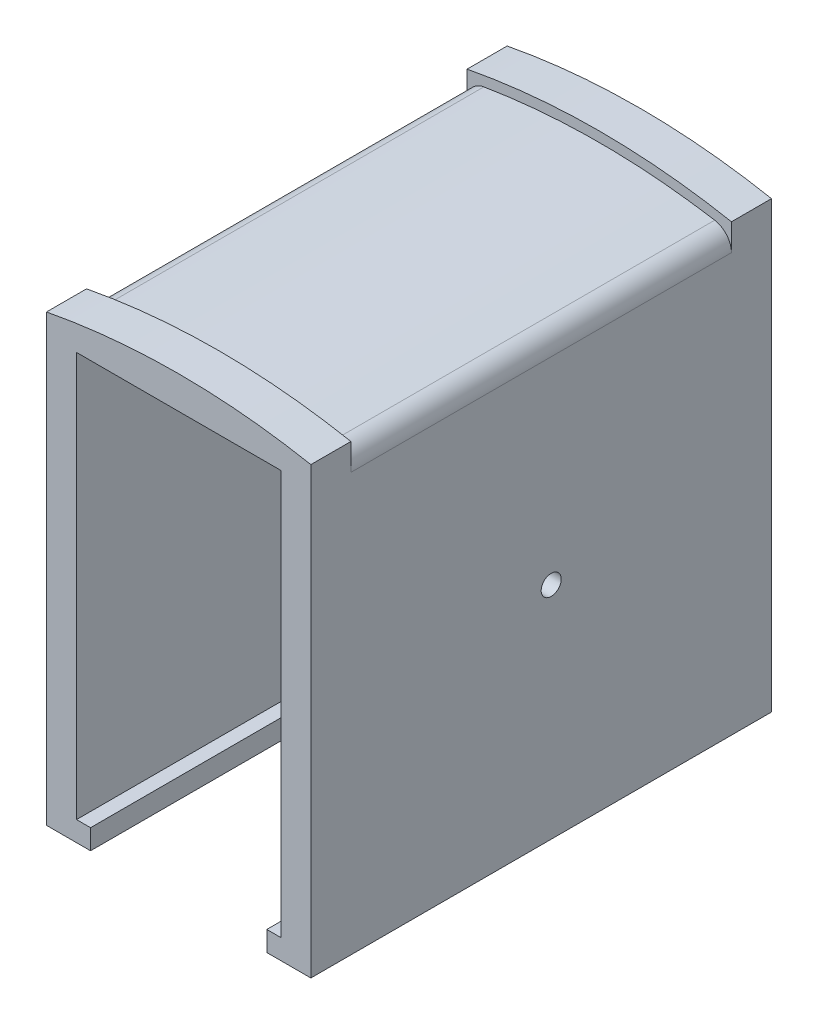
ISO-10303-21;
HEADER;
FILE_DESCRIPTION(('STEP AP214'),'2;1');
FILE_NAME('part.step','',(''),(''),'','','');
FILE_SCHEMA(('AUTOMOTIVE_DESIGN { 1 0 10303 214 1 1 1 1 }'));
ENDSEC;
DATA;
#1=APPLICATION_CONTEXT('core data for automotive mechanical design processes');
#2=APPLICATION_PROTOCOL_DEFINITION('international standard','automotive_design',2000,#1);
#3=PRODUCT_CONTEXT('',#1,'mechanical');
#4=PRODUCT('Part','Part','',(#3));
#5=PRODUCT_RELATED_PRODUCT_CATEGORY('part','',(#4));
#6=PRODUCT_DEFINITION_FORMATION('','',#4);
#7=PRODUCT_DEFINITION_CONTEXT('part definition',#1,'design');
#8=PRODUCT_DEFINITION('design','',#6,#7);
#9=PRODUCT_DEFINITION_SHAPE('','',#8);
#10=(LENGTH_UNIT() NAMED_UNIT(*) SI_UNIT(.MILLI.,.METRE.));
#11=(NAMED_UNIT(*) PLANE_ANGLE_UNIT() SI_UNIT($,.RADIAN.));
#12=(NAMED_UNIT(*) SI_UNIT($,.STERADIAN.) SOLID_ANGLE_UNIT());
#13=UNCERTAINTY_MEASURE_WITH_UNIT(LENGTH_MEASURE(1.E-05),#10,'distance_accuracy_value','');
#14=(GEOMETRIC_REPRESENTATION_CONTEXT(3) GLOBAL_UNCERTAINTY_ASSIGNED_CONTEXT((#13)) GLOBAL_UNIT_ASSIGNED_CONTEXT((#10,
#11,#12)) REPRESENTATION_CONTEXT('',''));
#15=CARTESIAN_POINT('',(0.,0.,0.));
#16=DIRECTION('',(0.,0.,1.));
#17=DIRECTION('',(1.,0.,0.));
#18=AXIS2_PLACEMENT_3D('',#15,#16,#17);
#19=CARTESIAN_POINT('',(0.,-86.0350875035356,25.4));
#20=DIRECTION('',(0.,0.,-1.));
#21=DIRECTION('',(-1.,0.,0.));
#22=AXIS2_PLACEMENT_3D('',#19,#20,#21);
#23=CYLINDRICAL_SURFACE('',#22,88.9);
#24=CARTESIAN_POINT('',(0.,-86.0350875035356,25.4));
#25=DIRECTION('',(0.,0.,1.));
#26=DIRECTION('',(-1.,0.,0.));
#27=AXIS2_PLACEMENT_3D('',#24,#25,#26);
#28=CIRCLE('',#27,88.9);
#29=CARTESIAN_POINT('',(14.6423529411765,1.65078080114635,25.4));
#30=VERTEX_POINT('',#29);
#31=CARTESIAN_POINT('',(-14.6423529411765,1.65078080114635,25.4));
#32=VERTEX_POINT('',#31);
#33=EDGE_CURVE('E266',#30,#32,#28,.T.);
#34=ORIENTED_EDGE('',*,*,#33,.F.);
#35=DIRECTION('',(0.,0.,-1.));
#36=VECTOR('',#35,1.);
#37=CARTESIAN_POINT('',(14.6423529411765,1.65078080114636,25.4));
#38=LINE('',#37,#36);
#39=CARTESIAN_POINT('',(14.6423529411765,1.65078080114635,-22.86));
#40=VERTEX_POINT('',#39);
#41=EDGE_CURVE('E291',#30,#40,#38,.T.);
#42=ORIENTED_EDGE('',*,*,#41,.T.);
#43=CARTESIAN_POINT('',(0.,-86.0350875035356,-22.86));
#44=DIRECTION('',(0.,0.,-1.));
#45=DIRECTION('',(-1.,0.,0.));
#46=AXIS2_PLACEMENT_3D('',#43,#44,#45);
#47=CIRCLE('',#46,88.9);
#48=CARTESIAN_POINT('',(-14.6423529411765,1.65078080114635,-22.86));
#49=VERTEX_POINT('',#48);
#50=EDGE_CURVE('E178',#49,#40,#47,.T.);
#51=ORIENTED_EDGE('',*,*,#50,.F.);
#52=DIRECTION('',(0.,0.,-1.));
#53=VECTOR('',#52,1.);
#54=CARTESIAN_POINT('',(-14.6423529411765,1.65078080114636,25.4));
#55=LINE('',#54,#53);
#56=EDGE_CURVE('E289',#49,#32,#55,.F.);
#57=ORIENTED_EDGE('',*,*,#56,.T.);
#58=EDGE_LOOP('',(#34,#42,#51,#57));
#59=FACE_BOUND('',#58,.T.);
#60=ADVANCED_FACE('F34',(#59),#23,.T.);
#61=CARTESIAN_POINT('',(-12.954,0.,25.4));
#62=DIRECTION('',(-1.,0.,0.));
#63=DIRECTION('',(0.,-1.,0.));
#64=AXIS2_PLACEMENT_3D('',#61,#62,#63);
#65=PLANE('',#64);
#66=CARTESIAN_POINT('',(-12.954,-25.908,0.));
#67=DIRECTION('',(-1.,0.,0.));
#68=DIRECTION('',(0.,-1.,0.));
#69=AXIS2_PLACEMENT_3D('',#66,#67,#68);
#70=CIRCLE('',#69,1.27);
#71=CARTESIAN_POINT('',(-12.954,-27.178,0.));
#72=VERTEX_POINT('',#71);
#73=EDGE_CURVE('E191',#72,#72,#70,.T.);
#74=ORIENTED_EDGE('',*,*,#73,.T.);
#75=EDGE_LOOP('',(#74));
#76=FACE_BOUND('',#75,.T.);
#77=DIRECTION('',(0.,1.,0.));
#78=VECTOR('',#77,1.);
#79=CARTESIAN_POINT('',(-12.954,-51.308,-27.94));
#80=LINE('',#79,#78);
#81=CARTESIAN_POINT('',(-12.954,-51.308,-27.94));
#82=VERTEX_POINT('',#81);
#83=CARTESIAN_POINT('',(-12.954,0.,-27.94));
#84=VERTEX_POINT('',#83);
#85=EDGE_CURVE('E190',#82,#84,#80,.T.);
#86=ORIENTED_EDGE('',*,*,#85,.T.);
#87=DIRECTION('',(0.,0.,-1.));
#88=VECTOR('',#87,1.);
#89=CARTESIAN_POINT('',(-12.954,0.,25.4));
#90=LINE('',#89,#88);
#91=CARTESIAN_POINT('',(-12.954,0.,30.48));
#92=VERTEX_POINT('',#91);
#93=EDGE_CURVE('E287',#92,#84,#90,.T.);
#94=ORIENTED_EDGE('',*,*,#93,.F.);
#95=DIRECTION('',(0.,1.,0.));
#96=VECTOR('',#95,1.);
#97=CARTESIAN_POINT('',(-12.954,-51.308,30.48));
#98=LINE('',#97,#96);
#99=CARTESIAN_POINT('',(-12.954,-51.308,30.48));
#100=VERTEX_POINT('',#99);
#101=EDGE_CURVE('E226',#100,#92,#98,.T.);
#102=ORIENTED_EDGE('',*,*,#101,.F.);
#103=DIRECTION('',(0.,0.,-1.));
#104=VECTOR('',#103,1.);
#105=CARTESIAN_POINT('',(-12.954,-51.308,25.4));
#106=LINE('',#105,#104);
#107=EDGE_CURVE('E269',#100,#82,#106,.T.);
#108=ORIENTED_EDGE('',*,*,#107,.T.);
#109=EDGE_LOOP('',(#86,#94,#102,#108));
#110=FACE_BOUND('',#109,.T.);
#111=ADVANCED_FACE('F362',(#76,#110),#65,.F.);
#112=CARTESIAN_POINT('',(-12.954,0.,25.4));
#113=DIRECTION('',(0.,1.,0.));
#114=DIRECTION('',(-1.,0.,0.));
#115=AXIS2_PLACEMENT_3D('',#112,#113,#114);
#116=PLANE('',#115);
#117=DIRECTION('',(1.,0.,0.));
#118=VECTOR('',#117,1.);
#119=CARTESIAN_POINT('',(-12.954,0.,-27.94));
#120=LINE('',#119,#118);
#121=CARTESIAN_POINT('',(12.954,0.,-27.94));
#122=VERTEX_POINT('',#121);
#123=EDGE_CURVE('E194',#84,#122,#120,.T.);
#124=ORIENTED_EDGE('',*,*,#123,.T.);
#125=DIRECTION('',(0.,0.,-1.));
#126=VECTOR('',#125,1.);
#127=CARTESIAN_POINT('',(12.954,0.,25.4));
#128=LINE('',#127,#126);
#129=CARTESIAN_POINT('',(12.954,0.,30.48));
#130=VERTEX_POINT('',#129);
#131=EDGE_CURVE('E285',#130,#122,#128,.T.);
#132=ORIENTED_EDGE('',*,*,#131,.F.);
#133=DIRECTION('',(1.,0.,0.));
#134=VECTOR('',#133,1.);
#135=CARTESIAN_POINT('',(-12.954,0.,30.48));
#136=LINE('',#135,#134);
#137=EDGE_CURVE('E229',#92,#130,#136,.T.);
#138=ORIENTED_EDGE('',*,*,#137,.F.);
#139=ORIENTED_EDGE('',*,*,#93,.T.);
#140=EDGE_LOOP('',(#124,#132,#138,#139));
#141=FACE_BOUND('',#140,.T.);
#142=ADVANCED_FACE('F349',(#141),#116,.F.);
#143=CARTESIAN_POINT('',(12.954,0.,25.4));
#144=DIRECTION('',(1.,0.,0.));
#145=DIRECTION('',(0.,1.,0.));
#146=AXIS2_PLACEMENT_3D('',#143,#144,#145);
#147=PLANE('',#146);
#148=CARTESIAN_POINT('',(12.954,-25.908,0.));
#149=DIRECTION('',(1.,0.,0.));
#150=DIRECTION('',(0.,1.,0.));
#151=AXIS2_PLACEMENT_3D('',#148,#149,#150);
#152=CIRCLE('',#151,1.27);
#153=CARTESIAN_POINT('',(12.954,-24.638,0.));
#154=VERTEX_POINT('',#153);
#155=EDGE_CURVE('E417',#154,#154,#152,.T.);
#156=ORIENTED_EDGE('',*,*,#155,.T.);
#157=EDGE_LOOP('',(#156));
#158=FACE_BOUND('',#157,.T.);
#159=DIRECTION('',(0.,-1.,0.));
#160=VECTOR('',#159,1.);
#161=CARTESIAN_POINT('',(12.954,0.,-27.94));
#162=LINE('',#161,#160);
#163=CARTESIAN_POINT('',(12.954,-51.308,-27.94));
#164=VERTEX_POINT('',#163);
#165=EDGE_CURVE('E197',#122,#164,#162,.T.);
#166=ORIENTED_EDGE('',*,*,#165,.T.);
#167=DIRECTION('',(0.,0.,-1.));
#168=VECTOR('',#167,1.);
#169=CARTESIAN_POINT('',(12.954,-51.308,25.4));
#170=LINE('',#169,#168);
#171=CARTESIAN_POINT('',(12.954,-51.308,30.48));
#172=VERTEX_POINT('',#171);
#173=EDGE_CURVE('E283',#172,#164,#170,.T.);
#174=ORIENTED_EDGE('',*,*,#173,.F.);
#175=DIRECTION('',(0.,-1.,0.));
#176=VECTOR('',#175,1.);
#177=CARTESIAN_POINT('',(12.954,0.,30.48));
#178=LINE('',#177,#176);
#179=EDGE_CURVE('E232',#130,#172,#178,.T.);
#180=ORIENTED_EDGE('',*,*,#179,.F.);
#181=ORIENTED_EDGE('',*,*,#131,.T.);
#182=EDGE_LOOP('',(#166,#174,#180,#181));
#183=FACE_BOUND('',#182,.T.);
#184=ADVANCED_FACE('F353',(#158,#183),#147,.F.);
#185=CARTESIAN_POINT('',(12.954,-51.308,25.4));
#186=DIRECTION('',(0.,-1.,0.));
#187=DIRECTION('',(0.,0.,-1.));
#188=AXIS2_PLACEMENT_3D('',#185,#186,#187);
#189=PLANE('',#188);
#190=DIRECTION('',(-1.,0.,0.));
#191=VECTOR('',#190,1.);
#192=CARTESIAN_POINT('',(12.954,-51.308,-27.94));
#193=LINE('',#192,#191);
#194=CARTESIAN_POINT('',(11.176,-51.308,-27.94));
#195=VERTEX_POINT('',#194);
#196=EDGE_CURVE('E200',#164,#195,#193,.T.);
#197=ORIENTED_EDGE('',*,*,#196,.T.);
#198=DIRECTION('',(0.,0.,-1.));
#199=VECTOR('',#198,1.);
#200=CARTESIAN_POINT('',(11.176,-51.308,25.4));
#201=LINE('',#200,#199);
#202=CARTESIAN_POINT('',(11.176,-51.308,30.48));
#203=VERTEX_POINT('',#202);
#204=EDGE_CURVE('E281',#203,#195,#201,.T.);
#205=ORIENTED_EDGE('',*,*,#204,.F.);
#206=DIRECTION('',(-1.,0.,0.));
#207=VECTOR('',#206,1.);
#208=CARTESIAN_POINT('',(12.954,-51.308,30.48));
#209=LINE('',#208,#207);
#210=EDGE_CURVE('E235',#172,#203,#209,.T.);
#211=ORIENTED_EDGE('',*,*,#210,.F.);
#212=ORIENTED_EDGE('',*,*,#173,.T.);
#213=EDGE_LOOP('',(#197,#205,#211,#212));
#214=FACE_BOUND('',#213,.T.);
#215=ADVANCED_FACE('F358',(#214),#189,.F.);
#216=CARTESIAN_POINT('',(11.176,-51.308,25.4));
#217=DIRECTION('',(1.,0.,0.));
#218=DIRECTION('',(0.,0.,-1.));
#219=AXIS2_PLACEMENT_3D('',#216,#217,#218);
#220=PLANE('',#219);
#221=DIRECTION('',(0.,-1.,0.));
#222=VECTOR('',#221,1.);
#223=CARTESIAN_POINT('',(11.176,-51.308,-27.94));
#224=LINE('',#223,#222);
#225=CARTESIAN_POINT('',(11.176,-53.848,-27.94));
#226=VERTEX_POINT('',#225);
#227=EDGE_CURVE('E203',#195,#226,#224,.T.);
#228=ORIENTED_EDGE('',*,*,#227,.T.);
#229=DIRECTION('',(0.,0.,-1.));
#230=VECTOR('',#229,1.);
#231=CARTESIAN_POINT('',(11.176,-53.848,25.4));
#232=LINE('',#231,#230);
#233=CARTESIAN_POINT('',(11.176,-53.848,30.48));
#234=VERTEX_POINT('',#233);
#235=EDGE_CURVE('E279',#234,#226,#232,.T.);
#236=ORIENTED_EDGE('',*,*,#235,.F.);
#237=DIRECTION('',(0.,-1.,0.));
#238=VECTOR('',#237,1.);
#239=CARTESIAN_POINT('',(11.176,-51.308,30.48));
#240=LINE('',#239,#238);
#241=EDGE_CURVE('E238',#203,#234,#240,.T.);
#242=ORIENTED_EDGE('',*,*,#241,.F.);
#243=ORIENTED_EDGE('',*,*,#204,.T.);
#244=EDGE_LOOP('',(#228,#236,#242,#243));
#245=FACE_BOUND('',#244,.T.);
#246=ADVANCED_FACE('F360',(#245),#220,.F.);
#247=CARTESIAN_POINT('',(11.176,-53.848,25.4));
#248=DIRECTION('',(0.,1.,0.));
#249=DIRECTION('',(0.,0.,1.));
#250=AXIS2_PLACEMENT_3D('',#247,#248,#249);
#251=PLANE('',#250);
#252=DIRECTION('',(1.,0.,0.));
#253=VECTOR('',#252,1.);
#254=CARTESIAN_POINT('',(11.176,-53.848,-27.94));
#255=LINE('',#254,#253);
#256=CARTESIAN_POINT('',(16.764,-53.848,-27.94));
#257=VERTEX_POINT('',#256);
#258=EDGE_CURVE('E206',#226,#257,#255,.T.);
#259=ORIENTED_EDGE('',*,*,#258,.T.);
#260=DIRECTION('',(0.,0.,-1.));
#261=VECTOR('',#260,1.);
#262=CARTESIAN_POINT('',(16.764,-53.848,25.4));
#263=LINE('',#262,#261);
#264=CARTESIAN_POINT('',(16.764,-53.848,30.48));
#265=VERTEX_POINT('',#264);
#266=EDGE_CURVE('E277',#265,#257,#263,.T.);
#267=ORIENTED_EDGE('',*,*,#266,.F.);
#268=DIRECTION('',(1.,0.,0.));
#269=VECTOR('',#268,1.);
#270=CARTESIAN_POINT('',(11.176,-53.848,30.48));
#271=LINE('',#270,#269);
#272=EDGE_CURVE('E241',#234,#265,#271,.T.);
#273=ORIENTED_EDGE('',*,*,#272,.F.);
#274=ORIENTED_EDGE('',*,*,#235,.T.);
#275=EDGE_LOOP('',(#259,#267,#273,#274));
#276=FACE_BOUND('',#275,.T.);
#277=ADVANCED_FACE('F327',(#276),#251,.F.);
#278=CARTESIAN_POINT('',(16.764,-53.848,25.4));
#279=DIRECTION('',(-1.,0.,0.));
#280=DIRECTION('',(0.,-1.,0.));
#281=AXIS2_PLACEMENT_3D('',#278,#279,#280);
#282=PLANE('',#281);
#283=CARTESIAN_POINT('',(16.764,-25.908,0.));
#284=DIRECTION('',(-1.,0.,0.));
#285=DIRECTION('',(0.,0.,1.));
#286=AXIS2_PLACEMENT_3D('',#283,#284,#285);
#287=CIRCLE('',#286,1.27);
#288=CARTESIAN_POINT('',(16.764,-25.908,1.27));
#289=VERTEX_POINT('',#288);
#290=EDGE_CURVE('E419',#289,#289,#287,.T.);
#291=ORIENTED_EDGE('',*,*,#290,.T.);
#292=EDGE_LOOP('',(#291));
#293=FACE_BOUND('',#292,.T.);
#294=DIRECTION('',(0.,1.,0.));
#295=VECTOR('',#294,1.);
#296=CARTESIAN_POINT('',(16.764,-53.848,-22.86));
#297=LINE('',#296,#295);
#298=CARTESIAN_POINT('',(16.764,-0.854529721844563,-22.86));
#299=VERTEX_POINT('',#298);
#300=CARTESIAN_POINT('',(16.764,2.54,-22.86));
#301=VERTEX_POINT('',#300);
#302=EDGE_CURVE('E158',#299,#301,#297,.T.);
#303=ORIENTED_EDGE('',*,*,#302,.F.);
#304=DIRECTION('',(0.,0.,-1.));
#305=VECTOR('',#304,1.);
#306=CARTESIAN_POINT('',(16.764,-0.854529721844563,25.4));
#307=LINE('',#306,#305);
#308=CARTESIAN_POINT('',(16.764,-0.854529721844563,25.4));
#309=VERTEX_POINT('',#308);
#310=EDGE_CURVE('E294',#299,#309,#307,.F.);
#311=ORIENTED_EDGE('',*,*,#310,.T.);
#312=DIRECTION('',(0.,1.,0.));
#313=VECTOR('',#312,1.);
#314=CARTESIAN_POINT('',(16.764,-53.848,25.4));
#315=LINE('',#314,#313);
#316=CARTESIAN_POINT('',(16.764,2.54,25.4));
#317=VERTEX_POINT('',#316);
#318=EDGE_CURVE('E222',#309,#317,#315,.T.);
#319=ORIENTED_EDGE('',*,*,#318,.T.);
#320=DIRECTION('',(0.,0.,-1.));
#321=VECTOR('',#320,1.);
#322=CARTESIAN_POINT('',(16.764,2.54,30.48));
#323=LINE('',#322,#321);
#324=CARTESIAN_POINT('',(16.764,2.54,30.48));
#325=VERTEX_POINT('',#324);
#326=EDGE_CURVE('E263',#325,#317,#323,.T.);
#327=ORIENTED_EDGE('',*,*,#326,.F.);
#328=DIRECTION('',(0.,1.,0.));
#329=VECTOR('',#328,1.);
#330=CARTESIAN_POINT('',(16.764,-53.848,30.48));
#331=LINE('',#330,#329);
#332=EDGE_CURVE('E244',#265,#325,#331,.T.);
#333=ORIENTED_EDGE('',*,*,#332,.F.);
#334=ORIENTED_EDGE('',*,*,#266,.T.);
#335=DIRECTION('',(0.,1.,0.));
#336=VECTOR('',#335,1.);
#337=CARTESIAN_POINT('',(16.764,-53.848,-27.94));
#338=LINE('',#337,#336);
#339=CARTESIAN_POINT('',(16.764,2.54,-27.94));
#340=VERTEX_POINT('',#339);
#341=EDGE_CURVE('E175',#257,#340,#338,.T.);
#342=ORIENTED_EDGE('',*,*,#341,.T.);
#343=DIRECTION('',(0.,0.,-1.));
#344=VECTOR('',#343,1.);
#345=CARTESIAN_POINT('',(16.764,2.54,-22.86));
#346=LINE('',#345,#344);
#347=EDGE_CURVE('E172',#301,#340,#346,.T.);
#348=ORIENTED_EDGE('',*,*,#347,.F.);
#349=EDGE_LOOP('',(#303,#311,#319,#327,#333,#334,#342,#348));
#350=FACE_BOUND('',#349,.T.);
#351=ADVANCED_FACE('F173',(#293,#350),#282,.F.);
#352=CARTESIAN_POINT('',(-16.764,-53.848,25.4));
#353=DIRECTION('',(1.,0.,0.));
#354=DIRECTION('',(0.,1.,0.));
#355=AXIS2_PLACEMENT_3D('',#352,#353,#354);
#356=PLANE('',#355);
#357=CARTESIAN_POINT('',(-16.764,-25.908,0.));
#358=DIRECTION('',(-1.,0.,0.));
#359=DIRECTION('',(0.,0.,1.));
#360=AXIS2_PLACEMENT_3D('',#357,#358,#359);
#361=CIRCLE('',#360,1.27);
#362=CARTESIAN_POINT('',(-16.764,-25.908,1.27));
#363=VERTEX_POINT('',#362);
#364=EDGE_CURVE('E422',#363,#363,#361,.T.);
#365=ORIENTED_EDGE('',*,*,#364,.F.);
#366=EDGE_LOOP('',(#365));
#367=FACE_BOUND('',#366,.T.);
#368=DIRECTION('',(0.,0.,-1.));
#369=VECTOR('',#368,1.);
#370=CARTESIAN_POINT('',(-16.764,-0.854529721844563,25.4));
#371=LINE('',#370,#369);
#372=CARTESIAN_POINT('',(-16.764,-0.854529721844563,25.4));
#373=VERTEX_POINT('',#372);
#374=CARTESIAN_POINT('',(-16.764,-0.854529721844563,-22.86));
#375=VERTEX_POINT('',#374);
#376=EDGE_CURVE('E296',#373,#375,#371,.T.);
#377=ORIENTED_EDGE('',*,*,#376,.T.);
#378=DIRECTION('',(0.,-1.,0.));
#379=VECTOR('',#378,1.);
#380=CARTESIAN_POINT('',(-16.764,-53.848,-22.86));
#381=LINE('',#380,#379);
#382=CARTESIAN_POINT('',(-16.764,2.53999999999999,-22.86));
#383=VERTEX_POINT('',#382);
#384=EDGE_CURVE('E49',#383,#375,#381,.T.);
#385=ORIENTED_EDGE('',*,*,#384,.F.);
#386=DIRECTION('',(0.,0.,-1.));
#387=VECTOR('',#386,1.);
#388=CARTESIAN_POINT('',(-16.764,2.53999999999999,-22.86));
#389=LINE('',#388,#387);
#390=CARTESIAN_POINT('',(-16.764,2.53999999999999,-27.94));
#391=VERTEX_POINT('',#390);
#392=EDGE_CURVE('E179',#383,#391,#389,.T.);
#393=ORIENTED_EDGE('',*,*,#392,.T.);
#394=DIRECTION('',(0.,-1.,0.));
#395=VECTOR('',#394,1.);
#396=CARTESIAN_POINT('',(-16.764,-53.848,-27.94));
#397=LINE('',#396,#395);
#398=CARTESIAN_POINT('',(-16.764,-53.848,-27.94));
#399=VERTEX_POINT('',#398);
#400=EDGE_CURVE('E212',#391,#399,#397,.T.);
#401=ORIENTED_EDGE('',*,*,#400,.T.);
#402=DIRECTION('',(0.,0.,-1.));
#403=VECTOR('',#402,1.);
#404=CARTESIAN_POINT('',(-16.764,-53.848,25.4));
#405=LINE('',#404,#403);
#406=CARTESIAN_POINT('',(-16.764,-53.848,30.48));
#407=VERTEX_POINT('',#406);
#408=EDGE_CURVE('E275',#407,#399,#405,.T.);
#409=ORIENTED_EDGE('',*,*,#408,.F.);
#410=DIRECTION('',(0.,-1.,0.));
#411=VECTOR('',#410,1.);
#412=CARTESIAN_POINT('',(-16.764,-53.848,30.48));
#413=LINE('',#412,#411);
#414=CARTESIAN_POINT('',(-16.764,2.53999999999999,30.48));
#415=VERTEX_POINT('',#414);
#416=EDGE_CURVE('E248',#415,#407,#413,.T.);
#417=ORIENTED_EDGE('',*,*,#416,.F.);
#418=DIRECTION('',(0.,0.,-1.));
#419=VECTOR('',#418,1.);
#420=CARTESIAN_POINT('',(-16.764,2.53999999999999,30.48));
#421=LINE('',#420,#419);
#422=CARTESIAN_POINT('',(-16.764,2.53999999999999,25.4));
#423=VERTEX_POINT('',#422);
#424=EDGE_CURVE('E257',#415,#423,#421,.T.);
#425=ORIENTED_EDGE('',*,*,#424,.T.);
#426=DIRECTION('',(0.,-1.,0.));
#427=VECTOR('',#426,1.);
#428=CARTESIAN_POINT('',(-16.764,-53.848,25.4));
#429=LINE('',#428,#427);
#430=EDGE_CURVE('E57',#423,#373,#429,.T.);
#431=ORIENTED_EDGE('',*,*,#430,.T.);
#432=EDGE_LOOP('',(#377,#385,#393,#401,#409,#417,#425,#431));
#433=FACE_BOUND('',#432,.T.);
#434=ADVANCED_FACE('F334',(#367,#433),#356,.F.);
#435=CARTESIAN_POINT('',(-11.176,-53.848,25.4));
#436=DIRECTION('',(0.,1.,0.));
#437=DIRECTION('',(-1.,0.,0.));
#438=AXIS2_PLACEMENT_3D('',#435,#436,#437);
#439=PLANE('',#438);
#440=DIRECTION('',(1.,0.,0.));
#441=VECTOR('',#440,1.);
#442=CARTESIAN_POINT('',(-16.764,-53.848,-27.94));
#443=LINE('',#442,#441);
#444=CARTESIAN_POINT('',(-11.176,-53.848,-27.94));
#445=VERTEX_POINT('',#444);
#446=EDGE_CURVE('E215',#399,#445,#443,.T.);
#447=ORIENTED_EDGE('',*,*,#446,.T.);
#448=DIRECTION('',(0.,0.,-1.));
#449=VECTOR('',#448,1.);
#450=CARTESIAN_POINT('',(-11.176,-53.848,25.4));
#451=LINE('',#450,#449);
#452=CARTESIAN_POINT('',(-11.176,-53.848,30.48));
#453=VERTEX_POINT('',#452);
#454=EDGE_CURVE('E273',#453,#445,#451,.T.);
#455=ORIENTED_EDGE('',*,*,#454,.F.);
#456=DIRECTION('',(1.,0.,0.));
#457=VECTOR('',#456,1.);
#458=CARTESIAN_POINT('',(-16.764,-53.848,30.48));
#459=LINE('',#458,#457);
#460=EDGE_CURVE('E251',#407,#453,#459,.T.);
#461=ORIENTED_EDGE('',*,*,#460,.F.);
#462=ORIENTED_EDGE('',*,*,#408,.T.);
#463=EDGE_LOOP('',(#447,#455,#461,#462));
#464=FACE_BOUND('',#463,.T.);
#465=ADVANCED_FACE('F337',(#464),#439,.F.);
#466=CARTESIAN_POINT('',(-11.176,-51.308,25.4));
#467=DIRECTION('',(-1.,0.,0.));
#468=DIRECTION('',(0.,0.,1.));
#469=AXIS2_PLACEMENT_3D('',#466,#467,#468);
#470=PLANE('',#469);
#471=DIRECTION('',(0.,1.,0.));
#472=VECTOR('',#471,1.);
#473=CARTESIAN_POINT('',(-11.176,-53.848,-27.94));
#474=LINE('',#473,#472);
#475=CARTESIAN_POINT('',(-11.176,-51.308,-27.94));
#476=VERTEX_POINT('',#475);
#477=EDGE_CURVE('E169',#445,#476,#474,.T.);
#478=ORIENTED_EDGE('',*,*,#477,.T.);
#479=DIRECTION('',(0.,0.,-1.));
#480=VECTOR('',#479,1.);
#481=CARTESIAN_POINT('',(-11.176,-51.308,25.4));
#482=LINE('',#481,#480);
#483=CARTESIAN_POINT('',(-11.176,-51.308,30.48));
#484=VERTEX_POINT('',#483);
#485=EDGE_CURVE('E271',#484,#476,#482,.T.);
#486=ORIENTED_EDGE('',*,*,#485,.F.);
#487=DIRECTION('',(0.,1.,0.));
#488=VECTOR('',#487,1.);
#489=CARTESIAN_POINT('',(-11.176,-53.848,30.48));
#490=LINE('',#489,#488);
#491=EDGE_CURVE('E254',#453,#484,#490,.T.);
#492=ORIENTED_EDGE('',*,*,#491,.F.);
#493=ORIENTED_EDGE('',*,*,#454,.T.);
#494=EDGE_LOOP('',(#478,#486,#492,#493));
#495=FACE_BOUND('',#494,.T.);
#496=ADVANCED_FACE('F341',(#495),#470,.F.);
#497=CARTESIAN_POINT('',(-12.954,-51.308,25.4));
#498=DIRECTION('',(0.,-1.,0.));
#499=DIRECTION('',(0.,0.,-1.));
#500=AXIS2_PLACEMENT_3D('',#497,#498,#499);
#501=PLANE('',#500);
#502=DIRECTION('',(-1.,0.,0.));
#503=VECTOR('',#502,1.);
#504=CARTESIAN_POINT('',(-11.176,-51.308,-27.94));
#505=LINE('',#504,#503);
#506=EDGE_CURVE('E187',#476,#82,#505,.T.);
#507=ORIENTED_EDGE('',*,*,#506,.T.);
#508=ORIENTED_EDGE('',*,*,#107,.F.);
#509=DIRECTION('',(-1.,0.,0.));
#510=VECTOR('',#509,1.);
#511=CARTESIAN_POINT('',(-11.176,-51.308,30.48));
#512=LINE('',#511,#510);
#513=EDGE_CURVE('E223',#484,#100,#512,.T.);
#514=ORIENTED_EDGE('',*,*,#513,.F.);
#515=ORIENTED_EDGE('',*,*,#485,.T.);
#516=EDGE_LOOP('',(#507,#508,#514,#515));
#517=FACE_BOUND('',#516,.T.);
#518=ADVANCED_FACE('F343',(#517),#501,.F.);
#519=CARTESIAN_POINT('',(0.,-84.7650875035356,30.48));
#520=DIRECTION('',(0.,0.,-1.));
#521=DIRECTION('',(-1.,0.,0.));
#522=AXIS2_PLACEMENT_3D('',#519,#520,#521);
#523=CYLINDRICAL_SURFACE('',#522,88.9);
#524=CARTESIAN_POINT('',(0.,-84.7650875035356,25.4));
#525=DIRECTION('',(0.,0.,1.));
#526=DIRECTION('',(-1.,0.,0.));
#527=AXIS2_PLACEMENT_3D('',#524,#525,#526);
#528=CIRCLE('',#527,88.9);
#529=EDGE_CURVE('E259',#317,#423,#528,.T.);
#530=ORIENTED_EDGE('',*,*,#529,.T.);
#531=ORIENTED_EDGE('',*,*,#424,.F.);
#532=CARTESIAN_POINT('',(0.,-84.7650875035356,30.48));
#533=DIRECTION('',(0.,0.,1.));
#534=DIRECTION('',(-1.,0.,0.));
#535=AXIS2_PLACEMENT_3D('',#532,#533,#534);
#536=CIRCLE('',#535,88.9);
#537=EDGE_CURVE('E246',#325,#415,#536,.T.);
#538=ORIENTED_EDGE('',*,*,#537,.F.);
#539=ORIENTED_EDGE('',*,*,#326,.T.);
#540=EDGE_LOOP('',(#530,#531,#538,#539));
#541=FACE_BOUND('',#540,.T.);
#542=ADVANCED_FACE('F318',(#541),#523,.T.);
#543=CARTESIAN_POINT('',(0.,-84.7650875035356,30.48));
#544=DIRECTION('',(0.,0.,-1.));
#545=DIRECTION('',(-1.,0.,0.));
#546=AXIS2_PLACEMENT_3D('',#543,#544,#545);
#547=PLANE('',#546);
#548=ORIENTED_EDGE('',*,*,#513,.T.);
#549=ORIENTED_EDGE('',*,*,#101,.T.);
#550=ORIENTED_EDGE('',*,*,#137,.T.);
#551=ORIENTED_EDGE('',*,*,#179,.T.);
#552=ORIENTED_EDGE('',*,*,#210,.T.);
#553=ORIENTED_EDGE('',*,*,#241,.T.);
#554=ORIENTED_EDGE('',*,*,#272,.T.);
#555=ORIENTED_EDGE('',*,*,#332,.T.);
#556=ORIENTED_EDGE('',*,*,#537,.T.);
#557=ORIENTED_EDGE('',*,*,#416,.T.);
#558=ORIENTED_EDGE('',*,*,#460,.T.);
#559=ORIENTED_EDGE('',*,*,#491,.T.);
#560=EDGE_LOOP('',(#548,#549,#550,#551,#552,#553,#554,#555,#556,#557,#558,#559));
#561=FACE_BOUND('',#560,.T.);
#562=ADVANCED_FACE('F322',(#561),#547,.F.);
#563=CARTESIAN_POINT('',(0.,-84.7650875035356,25.4));
#564=DIRECTION('',(0.,0.,-1.));
#565=DIRECTION('',(-1.,0.,0.));
#566=AXIS2_PLACEMENT_3D('',#563,#564,#565);
#567=PLANE('',#566);
#568=ORIENTED_EDGE('',*,*,#318,.F.);
#569=CARTESIAN_POINT('',(14.224,-0.854529721844563,25.4));
#570=DIRECTION('',(0.,0.,-1.));
#571=DIRECTION('',(-1.,0.,0.));
#572=AXIS2_PLACEMENT_3D('',#569,#570,#571);
#573=CIRCLE('',#572,2.54);
#574=EDGE_CURVE('E299',#309,#30,#573,.F.);
#575=ORIENTED_EDGE('',*,*,#574,.T.);
#576=ORIENTED_EDGE('',*,*,#33,.T.);
#577=CARTESIAN_POINT('',(-14.224,-0.854529721844563,25.4));
#578=DIRECTION('',(0.,0.,-1.));
#579=DIRECTION('',(-1.,0.,0.));
#580=AXIS2_PLACEMENT_3D('',#577,#578,#579);
#581=CIRCLE('',#580,2.54);
#582=EDGE_CURVE('E11',#32,#373,#581,.F.);
#583=ORIENTED_EDGE('',*,*,#582,.T.);
#584=ORIENTED_EDGE('',*,*,#430,.F.);
#585=ORIENTED_EDGE('',*,*,#529,.F.);
#586=EDGE_LOOP('',(#568,#575,#576,#583,#584,#585));
#587=FACE_BOUND('',#586,.T.);
#588=ADVANCED_FACE('F309',(#587),#567,.T.);
#589=CARTESIAN_POINT('',(0.,-84.7650875035356,-22.86));
#590=DIRECTION('',(0.,0.,-1.));
#591=DIRECTION('',(-1.,0.,0.));
#592=AXIS2_PLACEMENT_3D('',#589,#590,#591);
#593=PLANE('',#592);
#594=ORIENTED_EDGE('',*,*,#384,.T.);
#595=CARTESIAN_POINT('',(-14.224,-0.854529721844563,-22.86));
#596=DIRECTION('',(0.,0.,-1.));
#597=DIRECTION('',(-1.,0.,0.));
#598=AXIS2_PLACEMENT_3D('',#595,#596,#597);
#599=CIRCLE('',#598,2.54);
#600=EDGE_CURVE('E42',#375,#49,#599,.T.);
#601=ORIENTED_EDGE('',*,*,#600,.T.);
#602=ORIENTED_EDGE('',*,*,#50,.T.);
#603=CARTESIAN_POINT('',(14.224,-0.854529721844563,-22.86));
#604=DIRECTION('',(0.,0.,-1.));
#605=DIRECTION('',(-1.,0.,0.));
#606=AXIS2_PLACEMENT_3D('',#603,#604,#605);
#607=CIRCLE('',#606,2.54);
#608=EDGE_CURVE('E165',#40,#299,#607,.T.);
#609=ORIENTED_EDGE('',*,*,#608,.T.);
#610=ORIENTED_EDGE('',*,*,#302,.T.);
#611=CARTESIAN_POINT('',(0.,-84.7650875035356,-22.86));
#612=DIRECTION('',(0.,0.,1.));
#613=DIRECTION('',(-1.,0.,0.));
#614=AXIS2_PLACEMENT_3D('',#611,#612,#613);
#615=CIRCLE('',#614,88.9);
#616=EDGE_CURVE('E162',#301,#383,#615,.T.);
#617=ORIENTED_EDGE('',*,*,#616,.T.);
#618=EDGE_LOOP('',(#594,#601,#602,#609,#610,#617));
#619=FACE_BOUND('',#618,.T.);
#620=ADVANCED_FACE('F160',(#619),#593,.F.);
#621=CARTESIAN_POINT('',(0.,-84.7650875035356,-22.86));
#622=DIRECTION('',(0.,0.,-1.));
#623=DIRECTION('',(-1.,0.,0.));
#624=AXIS2_PLACEMENT_3D('',#621,#622,#623);
#625=CYLINDRICAL_SURFACE('',#624,88.9);
#626=CARTESIAN_POINT('',(0.,-84.7650875035356,-27.94));
#627=DIRECTION('',(0.,0.,1.));
#628=DIRECTION('',(-1.,0.,0.));
#629=AXIS2_PLACEMENT_3D('',#626,#627,#628);
#630=CIRCLE('',#629,88.9);
#631=EDGE_CURVE('E210',#340,#391,#630,.T.);
#632=ORIENTED_EDGE('',*,*,#631,.T.);
#633=ORIENTED_EDGE('',*,*,#392,.F.);
#634=ORIENTED_EDGE('',*,*,#616,.F.);
#635=ORIENTED_EDGE('',*,*,#347,.T.);
#636=EDGE_LOOP('',(#632,#633,#634,#635));
#637=FACE_BOUND('',#636,.T.);
#638=ADVANCED_FACE('F181',(#637),#625,.T.);
#639=CARTESIAN_POINT('',(0.,-84.7650875035356,-27.94));
#640=DIRECTION('',(0.,0.,-1.));
#641=DIRECTION('',(-1.,0.,0.));
#642=AXIS2_PLACEMENT_3D('',#639,#640,#641);
#643=PLANE('',#642);
#644=ORIENTED_EDGE('',*,*,#506,.F.);
#645=ORIENTED_EDGE('',*,*,#477,.F.);
#646=ORIENTED_EDGE('',*,*,#446,.F.);
#647=ORIENTED_EDGE('',*,*,#400,.F.);
#648=ORIENTED_EDGE('',*,*,#631,.F.);
#649=ORIENTED_EDGE('',*,*,#341,.F.);
#650=ORIENTED_EDGE('',*,*,#258,.F.);
#651=ORIENTED_EDGE('',*,*,#227,.F.);
#652=ORIENTED_EDGE('',*,*,#196,.F.);
#653=ORIENTED_EDGE('',*,*,#165,.F.);
#654=ORIENTED_EDGE('',*,*,#123,.F.);
#655=ORIENTED_EDGE('',*,*,#85,.F.);
#656=EDGE_LOOP('',(#644,#645,#646,#647,#648,#649,#650,#651,#652,#653,#654,#655));
#657=FACE_BOUND('',#656,.T.);
#658=ADVANCED_FACE('F331',(#657),#643,.T.);
#659=CARTESIAN_POINT('',(14.224,-0.854529721844563,25.4));
#660=DIRECTION('',(0.,0.,-1.));
#661=DIRECTION('',(-1.,0.,0.));
#662=AXIS2_PLACEMENT_3D('',#659,#660,#661);
#663=CYLINDRICAL_SURFACE('',#662,2.54);
#664=ORIENTED_EDGE('',*,*,#574,.F.);
#665=ORIENTED_EDGE('',*,*,#310,.F.);
#666=ORIENTED_EDGE('',*,*,#608,.F.);
#667=ORIENTED_EDGE('',*,*,#41,.F.);
#668=EDGE_LOOP('',(#664,#665,#666,#667));
#669=FACE_BOUND('',#668,.T.);
#670=ADVANCED_FACE('F313',(#669),#663,.T.);
#671=CARTESIAN_POINT('',(-14.224,-0.854529721844563,25.4));
#672=DIRECTION('',(0.,0.,-1.));
#673=DIRECTION('',(-1.,0.,0.));
#674=AXIS2_PLACEMENT_3D('',#671,#672,#673);
#675=CYLINDRICAL_SURFACE('',#674,2.54);
#676=ORIENTED_EDGE('',*,*,#582,.F.);
#677=ORIENTED_EDGE('',*,*,#56,.F.);
#678=ORIENTED_EDGE('',*,*,#600,.F.);
#679=ORIENTED_EDGE('',*,*,#376,.F.);
#680=EDGE_LOOP('',(#676,#677,#678,#679));
#681=FACE_BOUND('',#680,.T.);
#682=ADVANCED_FACE('F36',(#681),#675,.T.);
#683=CARTESIAN_POINT('',(16.764,-25.908,0.));
#684=DIRECTION('',(-1.,0.,0.));
#685=DIRECTION('',(0.,0.,1.));
#686=AXIS2_PLACEMENT_3D('',#683,#684,#685);
#687=CYLINDRICAL_SURFACE('',#686,1.27);
#688=ORIENTED_EDGE('',*,*,#364,.T.);
#689=EDGE_LOOP('',(#688));
#690=FACE_BOUND('',#689,.T.);
#691=ORIENTED_EDGE('',*,*,#73,.F.);
#692=EDGE_LOOP('',(#691));
#693=FACE_BOUND('',#692,.T.);
#694=ADVANCED_FACE('F379',(#690,#693),#687,.F.);
#695=ORIENTED_EDGE('',*,*,#290,.F.);
#696=EDGE_LOOP('',(#695));
#697=FACE_BOUND('',#696,.T.);
#698=ORIENTED_EDGE('',*,*,#155,.F.);
#699=EDGE_LOOP('',(#698));
#700=FACE_BOUND('',#699,.T.);
#701=ADVANCED_FACE('F430',(#697,#700),#687,.F.);
#702=CLOSED_SHELL('',(#60,#111,#142,#184,#215,#246,#277,#351,#434,#465,#496,#518,#542,#562,#588,
#620,#638,#658,#670,#682,#694,#701));
#703=MANIFOLD_SOLID_BREP('B2',#702);
#704=ADVANCED_BREP_SHAPE_REPRESENTATION('',(#18,#703),#14);
#705=SHAPE_DEFINITION_REPRESENTATION(#9,#704);
ENDSEC;
END-ISO-10303-21;
